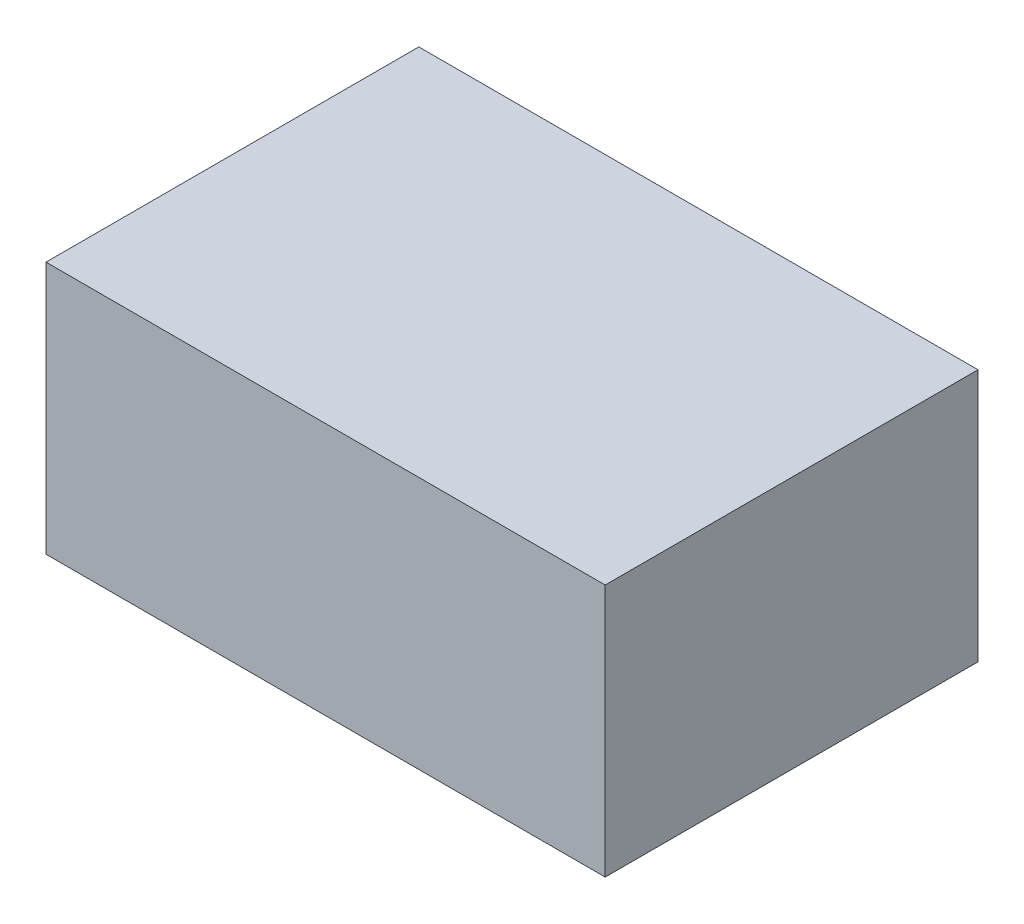
ISO-10303-21;
HEADER;
FILE_DESCRIPTION(('STEP AP214'),'2;1');
FILE_NAME('part.step','',(''),(''),'','','');
FILE_SCHEMA(('AUTOMOTIVE_DESIGN { 1 0 10303 214 1 1 1 1 }'));
ENDSEC;
DATA;
#1=APPLICATION_CONTEXT('core data for automotive mechanical design processes');
#2=APPLICATION_PROTOCOL_DEFINITION('international standard','automotive_design',2000,#1);
#3=PRODUCT_CONTEXT('',#1,'mechanical');
#4=PRODUCT('Part','Part','',(#3));
#5=PRODUCT_RELATED_PRODUCT_CATEGORY('part','',(#4));
#6=PRODUCT_DEFINITION_FORMATION('','',#4);
#7=PRODUCT_DEFINITION_CONTEXT('part definition',#1,'design');
#8=PRODUCT_DEFINITION('design','',#6,#7);
#9=PRODUCT_DEFINITION_SHAPE('','',#8);
#10=(LENGTH_UNIT() NAMED_UNIT(*) SI_UNIT(.MILLI.,.METRE.));
#11=(NAMED_UNIT(*) PLANE_ANGLE_UNIT() SI_UNIT($,.RADIAN.));
#12=(NAMED_UNIT(*) SI_UNIT($,.STERADIAN.) SOLID_ANGLE_UNIT());
#13=UNCERTAINTY_MEASURE_WITH_UNIT(LENGTH_MEASURE(1.E-05),#10,'distance_accuracy_value','');
#14=(GEOMETRIC_REPRESENTATION_CONTEXT(3) GLOBAL_UNCERTAINTY_ASSIGNED_CONTEXT((#13)) GLOBAL_UNIT_ASSIGNED_CONTEXT((#10,
#11,#12)) REPRESENTATION_CONTEXT('',''));
#15=CARTESIAN_POINT('',(0.,0.,0.));
#16=DIRECTION('',(0.,0.,1.));
#17=DIRECTION('',(1.,0.,0.));
#18=AXIS2_PLACEMENT_3D('',#15,#16,#17);
#19=CARTESIAN_POINT('',(2.1,1.9,-1.4));
#20=DIRECTION('',(-1.,0.,0.));
#21=DIRECTION('',(0.,0.,1.));
#22=AXIS2_PLACEMENT_3D('',#19,#20,#21);
#23=PLANE('',#22);
#24=DIRECTION('',(0.,0.,-1.));
#25=VECTOR('',#24,1.);
#26=CARTESIAN_POINT('',(2.1,0.,-1.4));
#27=LINE('',#26,#25);
#28=CARTESIAN_POINT('',(2.1,0.,1.4));
#29=VERTEX_POINT('',#28);
#30=CARTESIAN_POINT('',(2.1,0.,-1.4));
#31=VERTEX_POINT('',#30);
#32=EDGE_CURVE('E100',#29,#31,#27,.T.);
#33=ORIENTED_EDGE('',*,*,#32,.T.);
#34=DIRECTION('',(0.,-1.,0.));
#35=VECTOR('',#34,1.);
#36=CARTESIAN_POINT('',(2.1,1.9,-1.4));
#37=LINE('',#36,#35);
#38=CARTESIAN_POINT('',(2.1,1.9,-1.4));
#39=VERTEX_POINT('',#38);
#40=EDGE_CURVE('E11',#39,#31,#37,.T.);
#41=ORIENTED_EDGE('',*,*,#40,.F.);
#42=DIRECTION('',(0.,0.,-1.));
#43=VECTOR('',#42,1.);
#44=CARTESIAN_POINT('',(2.1,1.9,-1.4));
#45=LINE('',#44,#43);
#46=CARTESIAN_POINT('',(2.1,1.9,1.4));
#47=VERTEX_POINT('',#46);
#48=EDGE_CURVE('E88',#47,#39,#45,.T.);
#49=ORIENTED_EDGE('',*,*,#48,.F.);
#50=DIRECTION('',(0.,-1.,0.));
#51=VECTOR('',#50,1.);
#52=CARTESIAN_POINT('',(2.1,1.9,1.4));
#53=LINE('',#52,#51);
#54=EDGE_CURVE('E96',#47,#29,#53,.T.);
#55=ORIENTED_EDGE('',*,*,#54,.T.);
#56=EDGE_LOOP('',(#33,#41,#49,#55));
#57=FACE_BOUND('',#56,.T.);
#58=ADVANCED_FACE('F37',(#57),#23,.F.);
#59=CARTESIAN_POINT('',(-2.1,1.9,-1.4));
#60=DIRECTION('',(0.,0.,1.));
#61=DIRECTION('',(1.,0.,0.));
#62=AXIS2_PLACEMENT_3D('',#59,#60,#61);
#63=PLANE('',#62);
#64=DIRECTION('',(-1.,0.,0.));
#65=VECTOR('',#64,1.);
#66=CARTESIAN_POINT('',(-2.1,0.,-1.4));
#67=LINE('',#66,#65);
#68=CARTESIAN_POINT('',(-2.1,0.,-1.4));
#69=VERTEX_POINT('',#68);
#70=EDGE_CURVE('E92',#31,#69,#67,.T.);
#71=ORIENTED_EDGE('',*,*,#70,.T.);
#72=DIRECTION('',(0.,-1.,0.));
#73=VECTOR('',#72,1.);
#74=CARTESIAN_POINT('',(-2.1,1.9,-1.4));
#75=LINE('',#74,#73);
#76=CARTESIAN_POINT('',(-2.1,1.9,-1.4));
#77=VERTEX_POINT('',#76);
#78=EDGE_CURVE('E45',#77,#69,#75,.T.);
#79=ORIENTED_EDGE('',*,*,#78,.F.);
#80=DIRECTION('',(-1.,0.,0.));
#81=VECTOR('',#80,1.);
#82=CARTESIAN_POINT('',(-2.1,1.9,-1.4));
#83=LINE('',#82,#81);
#84=EDGE_CURVE('E83',#39,#77,#83,.T.);
#85=ORIENTED_EDGE('',*,*,#84,.F.);
#86=ORIENTED_EDGE('',*,*,#40,.T.);
#87=EDGE_LOOP('',(#71,#79,#85,#86));
#88=FACE_BOUND('',#87,.T.);
#89=ADVANCED_FACE('F91',(#88),#63,.F.);
#90=CARTESIAN_POINT('',(-2.1,1.9,-1.4));
#91=DIRECTION('',(1.,0.,0.));
#92=DIRECTION('',(0.,0.,-1.));
#93=AXIS2_PLACEMENT_3D('',#90,#91,#92);
#94=PLANE('',#93);
#95=DIRECTION('',(0.,0.,1.));
#96=VECTOR('',#95,1.);
#97=CARTESIAN_POINT('',(-2.1,0.,-1.4));
#98=LINE('',#97,#96);
#99=CARTESIAN_POINT('',(-2.1,0.,1.4));
#100=VERTEX_POINT('',#99);
#101=EDGE_CURVE('E70',#69,#100,#98,.T.);
#102=ORIENTED_EDGE('',*,*,#101,.T.);
#103=DIRECTION('',(0.,-1.,0.));
#104=VECTOR('',#103,1.);
#105=CARTESIAN_POINT('',(-2.1,1.9,1.4));
#106=LINE('',#105,#104);
#107=CARTESIAN_POINT('',(-2.1,1.9,1.4));
#108=VERTEX_POINT('',#107);
#109=EDGE_CURVE('E93',#108,#100,#106,.T.);
#110=ORIENTED_EDGE('',*,*,#109,.F.);
#111=DIRECTION('',(0.,0.,1.));
#112=VECTOR('',#111,1.);
#113=CARTESIAN_POINT('',(-2.1,1.9,-1.4));
#114=LINE('',#113,#112);
#115=EDGE_CURVE('E86',#77,#108,#114,.T.);
#116=ORIENTED_EDGE('',*,*,#115,.F.);
#117=ORIENTED_EDGE('',*,*,#78,.T.);
#118=EDGE_LOOP('',(#102,#110,#116,#117));
#119=FACE_BOUND('',#118,.T.);
#120=ADVANCED_FACE('F94',(#119),#94,.F.);
#121=CARTESIAN_POINT('',(-2.1,1.9,1.4));
#122=DIRECTION('',(0.,0.,-1.));
#123=DIRECTION('',(-1.,0.,0.));
#124=AXIS2_PLACEMENT_3D('',#121,#122,#123);
#125=PLANE('',#124);
#126=DIRECTION('',(1.,0.,0.));
#127=VECTOR('',#126,1.);
#128=CARTESIAN_POINT('',(-2.1,0.,1.4));
#129=LINE('',#128,#127);
#130=EDGE_CURVE('E76',#100,#29,#129,.T.);
#131=ORIENTED_EDGE('',*,*,#130,.T.);
#132=ORIENTED_EDGE('',*,*,#54,.F.);
#133=DIRECTION('',(1.,0.,0.));
#134=VECTOR('',#133,1.);
#135=CARTESIAN_POINT('',(-2.1,1.9,1.4));
#136=LINE('',#135,#134);
#137=EDGE_CURVE('E53',#108,#47,#136,.T.);
#138=ORIENTED_EDGE('',*,*,#137,.F.);
#139=ORIENTED_EDGE('',*,*,#109,.T.);
#140=EDGE_LOOP('',(#131,#132,#138,#139));
#141=FACE_BOUND('',#140,.T.);
#142=ADVANCED_FACE('F107',(#141),#125,.F.);
#143=CARTESIAN_POINT('',(0.,1.9,0.));
#144=DIRECTION('',(0.,1.,0.));
#145=DIRECTION('',(0.,0.,1.));
#146=AXIS2_PLACEMENT_3D('',#143,#144,#145);
#147=PLANE('',#146);
#148=ORIENTED_EDGE('',*,*,#48,.T.);
#149=ORIENTED_EDGE('',*,*,#84,.T.);
#150=ORIENTED_EDGE('',*,*,#115,.T.);
#151=ORIENTED_EDGE('',*,*,#137,.T.);
#152=EDGE_LOOP('',(#148,#149,#150,#151));
#153=FACE_BOUND('',#152,.T.);
#154=ADVANCED_FACE('F84',(#153),#147,.T.);
#155=CARTESIAN_POINT('',(0.,0.,0.));
#156=DIRECTION('',(0.,1.,0.));
#157=DIRECTION('',(0.,0.,1.));
#158=AXIS2_PLACEMENT_3D('',#155,#156,#157);
#159=PLANE('',#158);
#160=ORIENTED_EDGE('',*,*,#32,.F.);
#161=ORIENTED_EDGE('',*,*,#130,.F.);
#162=ORIENTED_EDGE('',*,*,#101,.F.);
#163=ORIENTED_EDGE('',*,*,#70,.F.);
#164=EDGE_LOOP('',(#160,#161,#162,#163));
#165=FACE_BOUND('',#164,.T.);
#166=ADVANCED_FACE('F110',(#165),#159,.F.);
#167=CLOSED_SHELL('',(#58,#89,#120,#142,#154,#166));
#168=MANIFOLD_SOLID_BREP('B2',#167);
#169=ADVANCED_BREP_SHAPE_REPRESENTATION('',(#18,#168),#14);
#170=SHAPE_DEFINITION_REPRESENTATION(#9,#169);
ENDSEC;
END-ISO-10303-21;
